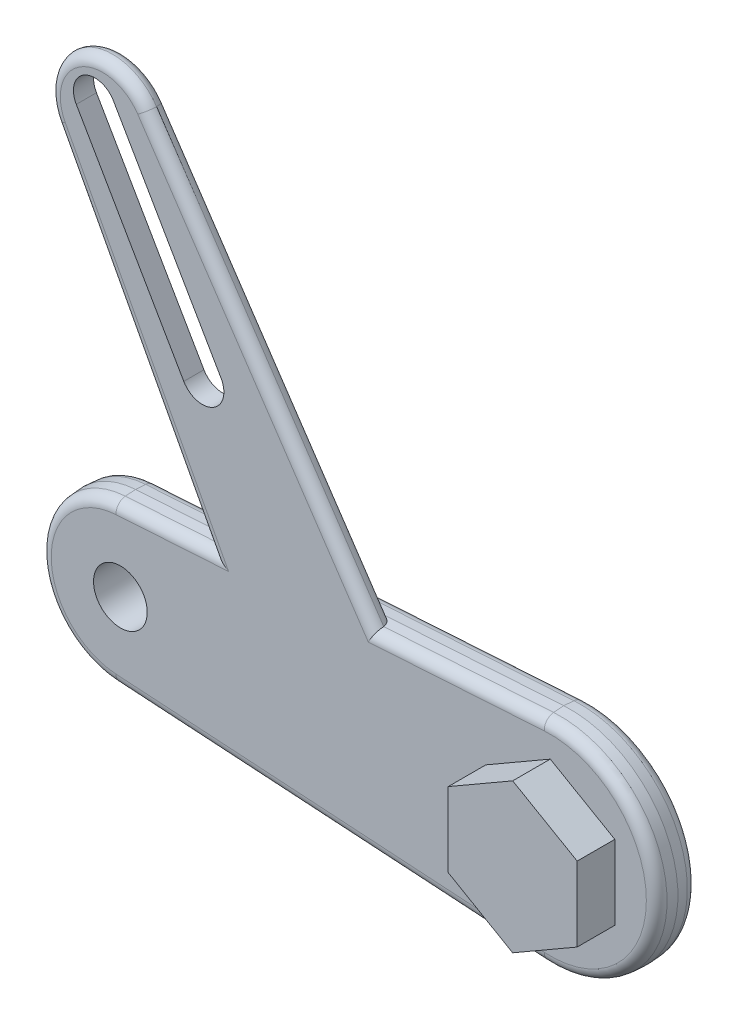
ISO-10303-21;
HEADER;
FILE_DESCRIPTION(('STEP AP214'),'2;1');
FILE_NAME('part.step','',(''),(''),'','','');
FILE_SCHEMA(('AUTOMOTIVE_DESIGN { 1 0 10303 214 1 1 1 1 }'));
ENDSEC;
DATA;
#1=APPLICATION_CONTEXT('core data for automotive mechanical design processes');
#2=APPLICATION_PROTOCOL_DEFINITION('international standard','automotive_design',2000,#1);
#3=PRODUCT_CONTEXT('',#1,'mechanical');
#4=PRODUCT('Part','Part','',(#3));
#5=PRODUCT_RELATED_PRODUCT_CATEGORY('part','',(#4));
#6=PRODUCT_DEFINITION_FORMATION('','',#4);
#7=PRODUCT_DEFINITION_CONTEXT('part definition',#1,'design');
#8=PRODUCT_DEFINITION('design','',#6,#7);
#9=PRODUCT_DEFINITION_SHAPE('','',#8);
#10=(LENGTH_UNIT() NAMED_UNIT(*) SI_UNIT(.MILLI.,.METRE.));
#11=(NAMED_UNIT(*) PLANE_ANGLE_UNIT() SI_UNIT($,.RADIAN.));
#12=(NAMED_UNIT(*) SI_UNIT($,.STERADIAN.) SOLID_ANGLE_UNIT());
#13=UNCERTAINTY_MEASURE_WITH_UNIT(LENGTH_MEASURE(1.E-05),#10,'distance_accuracy_value','');
#14=(GEOMETRIC_REPRESENTATION_CONTEXT(3) GLOBAL_UNCERTAINTY_ASSIGNED_CONTEXT((#13)) GLOBAL_UNIT_ASSIGNED_CONTEXT((#10,
#11,#12)) REPRESENTATION_CONTEXT('',''));
#15=CARTESIAN_POINT('',(0.,0.,0.));
#16=DIRECTION('',(0.,0.,1.));
#17=DIRECTION('',(1.,0.,0.));
#18=AXIS2_PLACEMENT_3D('',#15,#16,#17);
#19=CARTESIAN_POINT('',(47.1554252199413,0.,3.75));
#20=DIRECTION('',(0.,0.,1.));
#21=DIRECTION('',(1.,0.,0.));
#22=AXIS2_PLACEMENT_3D('',#19,#20,#21);
#23=PLANE('',#22);
#24=DIRECTION('',(-0.469471562785901,0.882947592858921,0.));
#25=VECTOR('',#24,1.);
#26=CARTESIAN_POINT('',(-14.0714459827987,16.7147194827275,3.75));
#27=LINE('',#26,#25);
#28=CARTESIAN_POINT('',(-43.0970655830937,71.303970438076,3.75));
#29=VERTEX_POINT('',#28);
#30=CARTESIAN_POINT('',(-12.7123795267605,14.1586872306922,3.75));
#31=VERTEX_POINT('',#30);
#32=EDGE_CURVE('E379',#29,#31,#27,.F.);
#33=ORIENTED_EDGE('',*,*,#32,.T.);
#34=DIRECTION('',(0.998044963916957,0.0625000000000001,0.));
#35=VECTOR('',#34,1.);
#36=CARTESIAN_POINT('',(-33.6491212977422,12.8475776033756,3.75));
#37=LINE('',#36,#35);
#38=CARTESIAN_POINT('',(-33.6491212977422,12.8475776033756,3.75));
#39=VERTEX_POINT('',#38);
#40=EDGE_CURVE('E391',#31,#39,#37,.F.);
#41=ORIENTED_EDGE('',*,*,#40,.T.);
#42=CARTESIAN_POINT('',(-32.8445747800587,0.,3.75));
#43=DIRECTION('',(0.,0.,1.));
#44=DIRECTION('',(1.,0.,0.));
#45=AXIS2_PLACEMENT_3D('',#42,#43,#44);
#46=CIRCLE('',#45,12.8727442829365);
#47=CARTESIAN_POINT('',(-33.6491212977422,-12.8475776033756,3.75));
#48=VERTEX_POINT('',#47);
#49=EDGE_CURVE('E388',#39,#48,#46,.T.);
#50=ORIENTED_EDGE('',*,*,#49,.T.);
#51=DIRECTION('',(-0.998044963916957,0.0625,0.));
#52=VECTOR('',#51,1.);
#53=CARTESIAN_POINT('',(46.0383787022578,-17.8378024229604,3.75));
#54=LINE('',#53,#52);
#55=CARTESIAN_POINT('',(46.0383787022578,-17.8378024229604,3.75));
#56=VERTEX_POINT('',#55);
#57=EDGE_CURVE('E385',#48,#56,#54,.F.);
#58=ORIENTED_EDGE('',*,*,#57,.T.);
#59=CARTESIAN_POINT('',(47.1554252199413,0.,3.75));
#60=DIRECTION('',(0.,0.,1.));
#61=DIRECTION('',(1.,0.,0.));
#62=AXIS2_PLACEMENT_3D('',#59,#60,#61);
#63=CIRCLE('',#62,17.8727442829365);
#64=CARTESIAN_POINT('',(46.0383787022578,17.8378024229604,3.75));
#65=VERTEX_POINT('',#64);
#66=EDGE_CURVE('E382',#56,#65,#63,.T.);
#67=ORIENTED_EDGE('',*,*,#66,.T.);
#68=DIRECTION('',(0.998044963916957,0.0625000000000001,0.));
#69=VECTOR('',#68,1.);
#70=CARTESIAN_POINT('',(14.3557226783546,15.853757542134,3.75));
#71=LINE('',#70,#69);
#72=CARTESIAN_POINT('',(13.2900577713771,15.7870230170434,3.75));
#73=VERTEX_POINT('',#72);
#74=EDGE_CURVE('E373',#65,#73,#71,.F.);
#75=ORIENTED_EDGE('',*,*,#74,.T.);
#76=DIRECTION('',(0.559192903470745,-0.829037572555043,0.));
#77=VECTOR('',#76,1.);
#78=CARTESIAN_POINT('',(-29.6190441596088,79.4023827338579,3.75));
#79=LINE('',#78,#77);
#80=CARTESIAN_POINT('',(-29.6190441596088,79.402382733858,3.75));
#81=VERTEX_POINT('',#80);
#82=EDGE_CURVE('E370',#73,#81,#79,.F.);
#83=ORIENTED_EDGE('',*,*,#82,.T.);
#84=CARTESIAN_POINT('',(-36.1458449692811,75.,3.75));
#85=DIRECTION('',(0.,0.,1.));
#86=DIRECTION('',(1.,0.,0.));
#87=AXIS2_PLACEMENT_3D('',#84,#85,#86);
#88=CIRCLE('',#87,7.87274428293651);
#89=EDGE_CURVE('E376',#81,#29,#88,.T.);
#90=ORIENTED_EDGE('',*,*,#89,.T.);
#91=EDGE_LOOP('',(#33,#41,#50,#58,#67,#75,#83,#90));
#92=FACE_BOUND('',#91,.T.);
#93=CARTESIAN_POINT('',(-32.8445747800587,0.,3.75));
#94=DIRECTION('',(0.,0.,1.));
#95=DIRECTION('',(1.,0.,0.));
#96=AXIS2_PLACEMENT_3D('',#93,#94,#95);
#97=CIRCLE('',#96,5.);
#98=CARTESIAN_POINT('',(-27.8445747800587,0.,3.75));
#99=VERTEX_POINT('',#98);
#100=EDGE_CURVE('E244',#99,#99,#97,.T.);
#101=ORIENTED_EDGE('',*,*,#100,.F.);
#102=EDGE_LOOP('',(#101));
#103=FACE_BOUND('',#102,.T.);
#104=CARTESIAN_POINT('',(-37.5834260577962,77.2693038813946,3.75));
#105=DIRECTION('',(0.,0.,1.));
#106=DIRECTION('',(1.,0.,0.));
#107=AXIS2_PLACEMENT_3D('',#104,#105,#106);
#108=CIRCLE('',#107,4.00000000000002);
#109=CARTESIAN_POINT('',(-34.1193244426584,79.2693038813946,3.75));
#110=VERTEX_POINT('',#109);
#111=CARTESIAN_POINT('',(-41.047527672934,75.2693038813945,3.75));
#112=VERTEX_POINT('',#111);
#113=EDGE_CURVE('E258',#110,#112,#108,.T.);
#114=ORIENTED_EDGE('',*,*,#113,.F.);
#115=DIRECTION('',(-0.500000000000003,0.866025403784437,0.));
#116=VECTOR('',#115,1.);
#117=CARTESIAN_POINT('',(-34.1193244426584,79.2693038813946,3.75));
#118=LINE('',#117,#116);
#119=CARTESIAN_POINT('',(-14.1193244426584,44.6282877300171,3.75));
#120=VERTEX_POINT('',#119);
#121=EDGE_CURVE('E270',#120,#110,#118,.T.);
#122=ORIENTED_EDGE('',*,*,#121,.F.);
#123=CARTESIAN_POINT('',(-17.5834260577961,42.6282877300171,3.75));
#124=DIRECTION('',(0.,0.,1.));
#125=DIRECTION('',(1.,0.,0.));
#126=AXIS2_PLACEMENT_3D('',#123,#124,#125);
#127=CIRCLE('',#126,4.00000000000013);
#128=CARTESIAN_POINT('',(-21.0475276729339,40.628287730017,3.75));
#129=VERTEX_POINT('',#128);
#130=EDGE_CURVE('E266',#129,#120,#127,.T.);
#131=ORIENTED_EDGE('',*,*,#130,.F.);
#132=DIRECTION('',(0.499999999999998,-0.86602540378444,0.));
#133=VECTOR('',#132,1.);
#134=CARTESIAN_POINT('',(-41.047527672934,75.2693038813945,3.75));
#135=LINE('',#134,#133);
#136=EDGE_CURVE('E262',#112,#129,#135,.T.);
#137=ORIENTED_EDGE('',*,*,#136,.F.);
#138=EDGE_LOOP('',(#114,#122,#131,#137));
#139=FACE_BOUND('',#138,.T.);
#140=DIRECTION('',(-0.866025403784439,-0.5,0.));
#141=VECTOR('',#140,1.);
#142=CARTESIAN_POINT('',(47.1554252199414,13.856406460551,3.75));
#143=LINE('',#142,#141);
#144=CARTESIAN_POINT('',(47.1554252199414,13.856406460551,3.75));
#145=VERTEX_POINT('',#144);
#146=CARTESIAN_POINT('',(35.1554252199413,6.92820323027551,3.75));
#147=VERTEX_POINT('',#146);
#148=EDGE_CURVE('E1030',#145,#147,#143,.T.);
#149=ORIENTED_EDGE('',*,*,#148,.F.);
#150=DIRECTION('',(-0.866025403784438,0.5,0.));
#151=VECTOR('',#150,1.);
#152=CARTESIAN_POINT('',(59.1554252199414,6.92820323027551,3.75));
#153=LINE('',#152,#151);
#154=CARTESIAN_POINT('',(59.1554252199414,6.92820323027551,3.75));
#155=VERTEX_POINT('',#154);
#156=EDGE_CURVE('E241',#155,#145,#153,.T.);
#157=ORIENTED_EDGE('',*,*,#156,.F.);
#158=DIRECTION('',(0.,1.,0.));
#159=VECTOR('',#158,1.);
#160=CARTESIAN_POINT('',(59.1554252199414,-6.92820323027551,3.75));
#161=LINE('',#160,#159);
#162=CARTESIAN_POINT('',(59.1554252199414,-6.92820323027551,3.75));
#163=VERTEX_POINT('',#162);
#164=EDGE_CURVE('E237',#163,#155,#161,.T.);
#165=ORIENTED_EDGE('',*,*,#164,.F.);
#166=DIRECTION('',(0.866025403784439,0.5,0.));
#167=VECTOR('',#166,1.);
#168=CARTESIAN_POINT('',(47.1554252199413,-13.856406460551,3.75));
#169=LINE('',#168,#167);
#170=CARTESIAN_POINT('',(47.1554252199413,-13.856406460551,3.75));
#171=VERTEX_POINT('',#170);
#172=EDGE_CURVE('E1025',#171,#163,#169,.T.);
#173=ORIENTED_EDGE('',*,*,#172,.F.);
#174=DIRECTION('',(0.866025403784438,-0.5,0.));
#175=VECTOR('',#174,1.);
#176=CARTESIAN_POINT('',(35.1554252199413,-6.92820323027551,3.75));
#177=LINE('',#176,#175);
#178=CARTESIAN_POINT('',(35.1554252199413,-6.92820323027551,3.75));
#179=VERTEX_POINT('',#178);
#180=EDGE_CURVE('E1042',#179,#171,#177,.T.);
#181=ORIENTED_EDGE('',*,*,#180,.F.);
#182=DIRECTION('',(0.,-1.,0.));
#183=VECTOR('',#182,1.);
#184=CARTESIAN_POINT('',(35.1554252199413,6.92820323027551,3.75));
#185=LINE('',#184,#183);
#186=EDGE_CURVE('E1035',#147,#179,#185,.T.);
#187=ORIENTED_EDGE('',*,*,#186,.F.);
#188=EDGE_LOOP('',(#149,#157,#165,#173,#181,#187));
#189=FACE_BOUND('',#188,.T.);
#190=ADVANCED_FACE('F44',(#92,#103,#139,#189),#23,.T.);
#191=CARTESIAN_POINT('',(-33.7820747800587,14.9706744587544,0.));
#192=DIRECTION('',(-0.0623477531412391,0.99561377654642,0.0697564737441255));
#193=DIRECTION('',(0.,-0.0698924504621114,0.997554532528624));
#194=AXIS2_PLACEMENT_3D('',#191,#192,#193);
#195=PLANE('',#194);
#196=DIRECTION('',(-0.00435977960900785,0.0696200973209298,-0.997564050259824));
#197=VECTOR('',#196,1.);
#198=CARTESIAN_POINT('',(-33.7820747800587,14.9706744587544,0.));
#199=LINE('',#198,#197);
#200=CARTESIAN_POINT('',(-33.7738168040247,14.8388051564684,1.88951294748825));
#201=VERTEX_POINT('',#200);
#202=CARTESIAN_POINT('',(-33.7820747800587,14.9706744587544,0.));
#203=VERTEX_POINT('',#202);
#204=EDGE_CURVE('E292',#201,#203,#199,.T.);
#205=ORIENTED_EDGE('',*,*,#204,.F.);
#206=DIRECTION('',(-0.998044963916957,-0.0625000000000001,0.));
#207=VECTOR('',#206,1.);
#208=CARTESIAN_POINT('',(-15.7263010045337,15.9689844352068,1.88951294748825));
#209=LINE('',#208,#207);
#210=CARTESIAN_POINT('',(-15.9278432201549,15.9563633720967,1.88951294748825));
#211=VERTEX_POINT('',#210);
#212=EDGE_CURVE('E395',#201,#211,#209,.F.);
#213=ORIENTED_EDGE('',*,*,#212,.T.);
#214=CARTESIAN_POINT('',(-13.7350591441457,16.0859396958927,2.));
#215=DIRECTION('',(-0.0623477531412391,0.99561377654642,0.0697564737441255));
#216=DIRECTION('',(0.987129361998023,0.0512013597358323,0.151505918836785));
#217=AXIS2_PLACEMENT_3D('',#214,#215,#216);
#218=ELLIPSE('',#217,2.20180589262586,2.);
#219=CARTESIAN_POINT('',(-13.8071653823816,16.2215518064594,0.));
#220=VERTEX_POINT('',#219);
#221=EDGE_CURVE('E55',#211,#220,#218,.F.);
#222=ORIENTED_EDGE('',*,*,#221,.T.);
#223=DIRECTION('',(-0.998044963916957,-0.0625000000000001,0.));
#224=VECTOR('',#223,1.);
#225=CARTESIAN_POINT('',(-33.7820747800587,14.9706744587544,0.));
#226=LINE('',#225,#224);
#227=EDGE_CURVE('E63',#220,#203,#226,.T.);
#228=ORIENTED_EDGE('',*,*,#227,.T.);
#229=EDGE_LOOP('',(#205,#213,#222,#228));
#230=FACE_BOUND('',#229,.T.);
#231=ADVANCED_FACE('F512',(#230),#195,.T.);
#232=CARTESIAN_POINT('',(45.9054252199413,19.9608992783391,0.));
#233=VERTEX_POINT('',#232);
#234=CARTESIAN_POINT('',(11.9085561692417,17.8319327563002,0.));
#235=VERTEX_POINT('',#234);
#236=EDGE_CURVE('E303',#233,#235,#226,.T.);
#237=ORIENTED_EDGE('',*,*,#236,.T.);
#238=CARTESIAN_POINT('',(11.9992428660925,17.6974841991859,2.));
#239=DIRECTION('',(-0.0623477531412391,0.99561377654642,0.0697564737441255));
#240=DIRECTION('',(-0.991588061139328,-0.053849115379293,-0.117700423868464));
#241=AXIS2_PLACEMENT_3D('',#238,#239,#240);
#242=ELLIPSE('',#241,2.32486325694468,2.);
#243=CARTESIAN_POINT('',(14.3053641981757,17.8496402603742,1.88951294748825));
#244=VERTEX_POINT('',#243);
#245=EDGE_CURVE('E11',#235,#244,#242,.F.);
#246=ORIENTED_EDGE('',*,*,#245,.T.);
#247=DIRECTION('',(-0.998044963916957,-0.0625000000000001,0.));
#248=VECTOR('',#247,1.);
#249=CARTESIAN_POINT('',(45.9136831959753,19.8290299760532,1.88951294748825));
#250=LINE('',#249,#248);
#251=CARTESIAN_POINT('',(45.9136831959753,19.8290299760532,1.88951294748825));
#252=VERTEX_POINT('',#251);
#253=EDGE_CURVE('E419',#244,#252,#250,.F.);
#254=ORIENTED_EDGE('',*,*,#253,.T.);
#255=DIRECTION('',(-0.00435977960900785,0.0696200973209298,-0.997564050259824));
#256=VECTOR('',#255,1.);
#257=CARTESIAN_POINT('',(45.9054252199413,19.9608992783391,0.));
#258=LINE('',#257,#256);
#259=EDGE_CURVE('E288',#252,#233,#258,.T.);
#260=ORIENTED_EDGE('',*,*,#259,.T.);
#261=EDGE_LOOP('',(#237,#246,#254,#260));
#262=FACE_BOUND('',#261,.T.);
#263=ADVANCED_FACE('F585',(#262),#195,.T.);
#264=CARTESIAN_POINT('',(47.1554252199413,0.,0.));
#265=DIRECTION('',(0.,0.,1.));
#266=DIRECTION('',(1.,0.,0.));
#267=AXIS2_PLACEMENT_3D('',#264,#265,#266);
#268=CONICAL_SURFACE('',#267,20.,0.0698131700797733);
#269=DIRECTION('',(-0.00435977960900784,-0.0696200973209298,0.997564050259824));
#270=VECTOR('',#269,1.);
#271=CARTESIAN_POINT('',(45.9054252199413,-19.9608992783391,0.));
#272=LINE('',#271,#270);
#273=CARTESIAN_POINT('',(45.9136831959753,-19.8290299760532,-1.88951294748825));
#274=VERTEX_POINT('',#273);
#275=CARTESIAN_POINT('',(45.9054252199413,-19.9608992783391,0.));
#276=VERTEX_POINT('',#275);
#277=EDGE_CURVE('E317',#274,#276,#272,.T.);
#278=ORIENTED_EDGE('',*,*,#277,.F.);
#279=CARTESIAN_POINT('',(47.1554252199413,0.,-1.88951294748825));
#280=DIRECTION('',(0.,0.,1.));
#281=DIRECTION('',(1.,0.,0.));
#282=AXIS2_PLACEMENT_3D('',#279,#280,#281);
#283=CIRCLE('',#282,19.8678723834562);
#284=CARTESIAN_POINT('',(45.9136831959753,19.8290299760532,-1.88951294748825));
#285=VERTEX_POINT('',#284);
#286=EDGE_CURVE('E416',#274,#285,#283,.T.);
#287=ORIENTED_EDGE('',*,*,#286,.T.);
#288=DIRECTION('',(-0.00435977960900784,0.0696200973209298,0.997564050259824));
#289=VECTOR('',#288,1.);
#290=CARTESIAN_POINT('',(45.9054252199413,19.9608992783391,0.));
#291=LINE('',#290,#289);
#292=EDGE_CURVE('E316',#285,#233,#291,.T.);
#293=ORIENTED_EDGE('',*,*,#292,.T.);
#294=CARTESIAN_POINT('',(47.1554252199413,0.,0.));
#295=DIRECTION('',(0.,0.,1.));
#296=DIRECTION('',(1.,0.,0.));
#297=AXIS2_PLACEMENT_3D('',#294,#295,#296);
#298=CIRCLE('',#297,20.);
#299=EDGE_CURVE('E291',#276,#233,#298,.T.);
#300=ORIENTED_EDGE('',*,*,#299,.F.);
#301=EDGE_LOOP('',(#278,#287,#293,#300));
#302=FACE_BOUND('',#301,.T.);
#303=ADVANCED_FACE('F601',(#302),#268,.T.);
#304=CARTESIAN_POINT('',(-33.7820747800587,-14.9706744587544,0.));
#305=DIRECTION('',(-0.062347753141239,-0.99561377654642,-0.0697564737441255));
#306=DIRECTION('',(0.,0.0698924504621114,-0.997554532528624));
#307=AXIS2_PLACEMENT_3D('',#304,#305,#306);
#308=PLANE('',#307);
#309=DIRECTION('',(-0.00435977960900785,-0.0696200973209298,0.997564050259824));
#310=VECTOR('',#309,1.);
#311=CARTESIAN_POINT('',(-33.7820747800587,-14.9706744587544,0.));
#312=LINE('',#311,#310);
#313=CARTESIAN_POINT('',(-33.7738168040247,-14.8388051564684,-1.88951294748825));
#314=VERTEX_POINT('',#313);
#315=CARTESIAN_POINT('',(-33.7820747800587,-14.9706744587544,0.));
#316=VERTEX_POINT('',#315);
#317=EDGE_CURVE('E322',#314,#316,#312,.T.);
#318=ORIENTED_EDGE('',*,*,#317,.F.);
#319=DIRECTION('',(0.998044963916957,-0.0625,0.));
#320=VECTOR('',#319,1.);
#321=CARTESIAN_POINT('',(45.9136831959753,-19.8290299760532,-1.88951294748825));
#322=LINE('',#321,#320);
#323=EDGE_CURVE('E347',#314,#274,#322,.T.);
#324=ORIENTED_EDGE('',*,*,#323,.T.);
#325=ORIENTED_EDGE('',*,*,#277,.T.);
#326=DIRECTION('',(0.998044963916957,-0.0625,0.));
#327=VECTOR('',#326,1.);
#328=CARTESIAN_POINT('',(-33.7820747800587,-14.9706744587544,0.));
#329=LINE('',#328,#327);
#330=EDGE_CURVE('E312',#316,#276,#329,.T.);
#331=ORIENTED_EDGE('',*,*,#330,.F.);
#332=EDGE_LOOP('',(#318,#324,#325,#331));
#333=FACE_BOUND('',#332,.T.);
#334=ADVANCED_FACE('F548',(#333),#308,.T.);
#335=CARTESIAN_POINT('',(-32.8445747800587,0.,0.));
#336=DIRECTION('',(0.,0.,1.));
#337=DIRECTION('',(1.,0.,0.));
#338=AXIS2_PLACEMENT_3D('',#335,#336,#337);
#339=CONICAL_SURFACE('',#338,15.,0.0698131700797733);
#340=DIRECTION('',(-0.00435977960900785,0.0696200973209298,0.997564050259824));
#341=VECTOR('',#340,1.);
#342=CARTESIAN_POINT('',(-33.7820747800587,14.9706744587544,0.));
#343=LINE('',#342,#341);
#344=CARTESIAN_POINT('',(-33.7738168040247,14.8388051564684,-1.88951294748825));
#345=VERTEX_POINT('',#344);
#346=EDGE_CURVE('E326',#345,#203,#343,.T.);
#347=ORIENTED_EDGE('',*,*,#346,.F.);
#348=CARTESIAN_POINT('',(-32.8445747800587,0.,-1.88951294748825));
#349=DIRECTION('',(0.,0.,1.));
#350=DIRECTION('',(1.,0.,0.));
#351=AXIS2_PLACEMENT_3D('',#348,#349,#350);
#352=CIRCLE('',#351,14.8678723834562);
#353=EDGE_CURVE('E364',#345,#314,#352,.T.);
#354=ORIENTED_EDGE('',*,*,#353,.T.);
#355=ORIENTED_EDGE('',*,*,#317,.T.);
#356=CARTESIAN_POINT('',(-32.8445747800587,0.,0.));
#357=DIRECTION('',(0.,0.,1.));
#358=DIRECTION('',(1.,0.,0.));
#359=AXIS2_PLACEMENT_3D('',#356,#357,#358);
#360=CIRCLE('',#359,15.);
#361=EDGE_CURVE('E307',#203,#316,#360,.T.);
#362=ORIENTED_EDGE('',*,*,#361,.F.);
#363=EDGE_LOOP('',(#347,#354,#355,#362));
#364=FACE_BOUND('',#363,.T.);
#365=ADVANCED_FACE('F516',(#364),#339,.T.);
#366=CARTESIAN_POINT('',(-33.7820747800587,14.9706744587544,0.));
#367=DIRECTION('',(-0.0623477531412391,0.99561377654642,-0.0697564737441255));
#368=DIRECTION('',(0.,0.0698924504621114,0.997554532528624));
#369=AXIS2_PLACEMENT_3D('',#366,#367,#368);
#370=PLANE('',#369);
#371=ORIENTED_EDGE('',*,*,#292,.F.);
#372=DIRECTION('',(-0.998044963916957,-0.0625000000000001,0.));
#373=VECTOR('',#372,1.);
#374=CARTESIAN_POINT('',(-33.7738168040247,14.8388051564684,-1.88951294748825));
#375=LINE('',#374,#373);
#376=EDGE_CURVE('E367',#285,#345,#375,.T.);
#377=ORIENTED_EDGE('',*,*,#376,.T.);
#378=ORIENTED_EDGE('',*,*,#346,.T.);
#379=ORIENTED_EDGE('',*,*,#227,.F.);
#380=EDGE_CURVE('E308',#235,#220,#226,.T.);
#381=ORIENTED_EDGE('',*,*,#380,.F.);
#382=ORIENTED_EDGE('',*,*,#236,.F.);
#383=EDGE_LOOP('',(#371,#377,#378,#379,#381,#382));
#384=FACE_BOUND('',#383,.T.);
#385=ADVANCED_FACE('F504',(#384),#370,.T.);
#386=CARTESIAN_POINT('',(47.1554252199413,0.,-3.75));
#387=DIRECTION('',(0.,0.,1.));
#388=DIRECTION('',(1.,0.,0.));
#389=AXIS2_PLACEMENT_3D('',#386,#387,#388);
#390=PLANE('',#389);
#391=CARTESIAN_POINT('',(47.1554252199413,0.,-3.75));
#392=DIRECTION('',(0.,0.,1.));
#393=DIRECTION('',(1.,0.,0.));
#394=AXIS2_PLACEMENT_3D('',#391,#392,#393);
#395=CIRCLE('',#394,17.8727442829365);
#396=CARTESIAN_POINT('',(46.0383787022578,17.8378024229604,-3.75));
#397=VERTEX_POINT('',#396);
#398=CARTESIAN_POINT('',(46.0383787022578,-17.8378024229604,-3.75));
#399=VERTEX_POINT('',#398);
#400=EDGE_CURVE('E351',#397,#399,#395,.F.);
#401=ORIENTED_EDGE('',*,*,#400,.T.);
#402=DIRECTION('',(0.998044963916957,-0.0625,0.));
#403=VECTOR('',#402,1.);
#404=CARTESIAN_POINT('',(-33.6491212977422,-12.8475776033756,-3.75));
#405=LINE('',#404,#403);
#406=CARTESIAN_POINT('',(-33.6491212977422,-12.8475776033756,-3.75));
#407=VERTEX_POINT('',#406);
#408=EDGE_CURVE('E360',#399,#407,#405,.F.);
#409=ORIENTED_EDGE('',*,*,#408,.T.);
#410=CARTESIAN_POINT('',(-32.8445747800587,0.,-3.75));
#411=DIRECTION('',(0.,0.,1.));
#412=DIRECTION('',(1.,0.,0.));
#413=AXIS2_PLACEMENT_3D('',#410,#411,#412);
#414=CIRCLE('',#413,12.8727442829365);
#415=CARTESIAN_POINT('',(-33.6491212977422,12.8475776033756,-3.75));
#416=VERTEX_POINT('',#415);
#417=EDGE_CURVE('E357',#407,#416,#414,.F.);
#418=ORIENTED_EDGE('',*,*,#417,.T.);
#419=DIRECTION('',(-0.998044963916957,-0.0625000000000001,0.));
#420=VECTOR('',#419,1.);
#421=CARTESIAN_POINT('',(46.0383787022578,17.8378024229604,-3.75));
#422=LINE('',#421,#420);
#423=EDGE_CURVE('E354',#416,#397,#422,.F.);
#424=ORIENTED_EDGE('',*,*,#423,.T.);
#425=EDGE_LOOP('',(#401,#409,#418,#424));
#426=FACE_BOUND('',#425,.T.);
#427=CARTESIAN_POINT('',(-32.8445747800587,0.,-3.75));
#428=DIRECTION('',(0.,0.,1.));
#429=DIRECTION('',(1.,0.,0.));
#430=AXIS2_PLACEMENT_3D('',#427,#428,#429);
#431=CIRCLE('',#430,5.);
#432=CARTESIAN_POINT('',(-27.8445747800587,0.,-3.75));
#433=VERTEX_POINT('',#432);
#434=EDGE_CURVE('E250',#433,#433,#431,.T.);
#435=ORIENTED_EDGE('',*,*,#434,.T.);
#436=EDGE_LOOP('',(#435));
#437=FACE_BOUND('',#436,.T.);
#438=ADVANCED_FACE('F538',(#426,#437),#390,.F.);
#439=CARTESIAN_POINT('',(47.1554252199413,0.,0.));
#440=DIRECTION('',(0.,0.,-1.));
#441=DIRECTION('',(1.,0.,0.));
#442=AXIS2_PLACEMENT_3D('',#439,#440,#441);
#443=CONICAL_SURFACE('',#442,20.,0.0698131700797733);
#444=ORIENTED_EDGE('',*,*,#259,.F.);
#445=CARTESIAN_POINT('',(47.1554252199413,0.,1.88951294748825));
#446=DIRECTION('',(0.,0.,-1.));
#447=DIRECTION('',(-1.,0.,0.));
#448=AXIS2_PLACEMENT_3D('',#445,#446,#447);
#449=CIRCLE('',#448,19.8678723834562);
#450=CARTESIAN_POINT('',(45.9136831959753,-19.8290299760532,1.88951294748825));
#451=VERTEX_POINT('',#450);
#452=EDGE_CURVE('E405',#252,#451,#449,.T.);
#453=ORIENTED_EDGE('',*,*,#452,.T.);
#454=DIRECTION('',(-0.00435977960900784,-0.0696200973209298,-0.997564050259824));
#455=VECTOR('',#454,1.);
#456=CARTESIAN_POINT('',(45.9054252199413,-19.9608992783391,0.));
#457=LINE('',#456,#455);
#458=EDGE_CURVE('E278',#451,#276,#457,.T.);
#459=ORIENTED_EDGE('',*,*,#458,.T.);
#460=ORIENTED_EDGE('',*,*,#299,.T.);
#461=EDGE_LOOP('',(#444,#453,#459,#460));
#462=FACE_BOUND('',#461,.T.);
#463=ADVANCED_FACE('F591',(#462),#443,.T.);
#464=CARTESIAN_POINT('',(-32.8445747800587,0.,0.));
#465=DIRECTION('',(0.,0.,-1.));
#466=DIRECTION('',(1.,0.,0.));
#467=AXIS2_PLACEMENT_3D('',#464,#465,#466);
#468=CONICAL_SURFACE('',#467,15.,0.0698131700797733);
#469=DIRECTION('',(-0.00435977960900784,-0.0696200973209298,-0.997564050259824));
#470=VECTOR('',#469,1.);
#471=CARTESIAN_POINT('',(-33.7820747800587,-14.9706744587544,0.));
#472=LINE('',#471,#470);
#473=CARTESIAN_POINT('',(-33.7738168040247,-14.8388051564684,1.88951294748825));
#474=VERTEX_POINT('',#473);
#475=EDGE_CURVE('E295',#474,#316,#472,.T.);
#476=ORIENTED_EDGE('',*,*,#475,.F.);
#477=CARTESIAN_POINT('',(-32.8445747800587,0.,1.88951294748825));
#478=DIRECTION('',(0.,0.,-1.));
#479=DIRECTION('',(-1.,0.,0.));
#480=AXIS2_PLACEMENT_3D('',#477,#478,#479);
#481=CIRCLE('',#480,14.8678723834562);
#482=EDGE_CURVE('E399',#474,#201,#481,.T.);
#483=ORIENTED_EDGE('',*,*,#482,.T.);
#484=ORIENTED_EDGE('',*,*,#204,.T.);
#485=ORIENTED_EDGE('',*,*,#361,.T.);
#486=EDGE_LOOP('',(#476,#483,#484,#485));
#487=FACE_BOUND('',#486,.T.);
#488=ADVANCED_FACE('F522',(#487),#468,.T.);
#489=CARTESIAN_POINT('',(-33.7820747800587,-14.9706744587544,0.));
#490=DIRECTION('',(-0.062347753141239,-0.99561377654642,0.0697564737441255));
#491=DIRECTION('',(0.,-0.0698924504621114,-0.997554532528624));
#492=AXIS2_PLACEMENT_3D('',#489,#490,#491);
#493=PLANE('',#492);
#494=ORIENTED_EDGE('',*,*,#458,.F.);
#495=DIRECTION('',(0.998044963916957,-0.0625,0.));
#496=VECTOR('',#495,1.);
#497=CARTESIAN_POINT('',(-33.7738168040247,-14.8388051564684,1.88951294748825));
#498=LINE('',#497,#496);
#499=EDGE_CURVE('E402',#451,#474,#498,.F.);
#500=ORIENTED_EDGE('',*,*,#499,.T.);
#501=ORIENTED_EDGE('',*,*,#475,.T.);
#502=ORIENTED_EDGE('',*,*,#330,.T.);
#503=EDGE_LOOP('',(#494,#500,#501,#502));
#504=FACE_BOUND('',#503,.T.);
#505=ADVANCED_FACE('F553',(#504),#493,.T.);
#506=CARTESIAN_POINT('',(-36.1458449692811,75.,0.));
#507=DIRECTION('',(0.,0.,1.));
#508=DIRECTION('',(1.,0.,0.));
#509=AXIS2_PLACEMENT_3D('',#506,#507,#508);
#510=PLANE('',#509);
#511=DIRECTION('',(-0.500000000000003,0.866025403784437,0.));
#512=VECTOR('',#511,1.);
#513=CARTESIAN_POINT('',(-32.7772917654325,76.9448350990216,0.));
#514=LINE('',#513,#512);
#515=CARTESIAN_POINT('',(-14.1193244426584,44.6282877300171,0.));
#516=VERTEX_POINT('',#515);
#517=CARTESIAN_POINT('',(-34.1193244426584,79.2693038813946,0.));
#518=VERTEX_POINT('',#517);
#519=EDGE_CURVE('E339',#516,#518,#514,.T.);
#520=ORIENTED_EDGE('',*,*,#519,.T.);
#521=CARTESIAN_POINT('',(-37.5834260577962,77.2693038813946,0.));
#522=DIRECTION('',(0.,0.,1.));
#523=DIRECTION('',(1.,0.,0.));
#524=AXIS2_PLACEMENT_3D('',#521,#522,#523);
#525=CIRCLE('',#524,4.00000000000002);
#526=CARTESIAN_POINT('',(-41.047527672934,75.2693038813945,0.));
#527=VERTEX_POINT('',#526);
#528=EDGE_CURVE('E343',#518,#527,#525,.T.);
#529=ORIENTED_EDGE('',*,*,#528,.T.);
#530=DIRECTION('',(0.499999999999998,-0.86602540378444,0.));
#531=VECTOR('',#530,1.);
#532=CARTESIAN_POINT('',(-39.705494995708,72.9448350990215,0.));
#533=LINE('',#532,#531);
#534=CARTESIAN_POINT('',(-21.0475276729341,40.628287730017,0.));
#535=VERTEX_POINT('',#534);
#536=EDGE_CURVE('E321',#527,#535,#533,.T.);
#537=ORIENTED_EDGE('',*,*,#536,.T.);
#538=CARTESIAN_POINT('',(-17.5834260577961,42.6282877300171,0.));
#539=DIRECTION('',(0.,0.,1.));
#540=DIRECTION('',(1.,0.,0.));
#541=AXIS2_PLACEMENT_3D('',#538,#539,#540);
#542=CIRCLE('',#541,4.00000000000013);
#543=EDGE_CURVE('E335',#535,#516,#542,.T.);
#544=ORIENTED_EDGE('',*,*,#543,.T.);
#545=EDGE_LOOP('',(#520,#529,#537,#544));
#546=FACE_BOUND('',#545,.T.);
#547=ORIENTED_EDGE('',*,*,#380,.T.);
#548=DIRECTION('',(0.469471562785901,-0.882947592858921,0.));
#549=VECTOR('',#548,1.);
#550=CARTESIAN_POINT('',(-43.095460631344,71.3048238060587,0.));
#551=LINE('',#550,#549);
#552=CARTESIAN_POINT('',(-43.095460631344,71.3048238060587,0.));
#553=VERTEX_POINT('',#552);
#554=EDGE_CURVE('E478',#220,#553,#551,.F.);
#555=ORIENTED_EDGE('',*,*,#554,.T.);
#556=CARTESIAN_POINT('',(-36.1458449692811,75.,0.));
#557=DIRECTION('',(0.,0.,1.));
#558=DIRECTION('',(1.,0.,0.));
#559=AXIS2_PLACEMENT_3D('',#556,#557,#558);
#560=CIRCLE('',#559,7.87092656265198);
#561=CARTESIAN_POINT('',(-29.6205511180211,79.4013662775744,0.));
#562=VERTEX_POINT('',#561);
#563=EDGE_CURVE('E475',#553,#562,#560,.F.);
#564=ORIENTED_EDGE('',*,*,#563,.T.);
#565=DIRECTION('',(-0.559192903470745,0.829037572555043,0.));
#566=VECTOR('',#565,1.);
#567=CARTESIAN_POINT('',(-29.6205511180211,79.4013662775744,0.));
#568=LINE('',#567,#566);
#569=EDGE_CURVE('E426',#562,#235,#568,.F.);
#570=ORIENTED_EDGE('',*,*,#569,.T.);
#571=EDGE_LOOP('',(#547,#555,#564,#570));
#572=FACE_BOUND('',#571,.T.);
#573=ADVANCED_FACE('F501',(#546,#572),#510,.F.);
#574=CARTESIAN_POINT('',(-37.5834260577962,77.2693038813946,-3.75));
#575=DIRECTION('',(0.,0.,1.));
#576=DIRECTION('',(1.,0.,0.));
#577=AXIS2_PLACEMENT_3D('',#574,#575,#576);
#578=CYLINDRICAL_SURFACE('',#577,4.00000000000002);
#579=DIRECTION('',(0.,0.,1.));
#580=VECTOR('',#579,1.);
#581=CARTESIAN_POINT('',(-34.1193244426584,79.2693038813946,-3.75));
#582=LINE('',#581,#580);
#583=EDGE_CURVE('E275',#518,#110,#582,.T.);
#584=ORIENTED_EDGE('',*,*,#583,.T.);
#585=ORIENTED_EDGE('',*,*,#113,.T.);
#586=DIRECTION('',(0.,0.,1.));
#587=VECTOR('',#586,1.);
#588=CARTESIAN_POINT('',(-41.047527672934,75.2693038813945,-3.75));
#589=LINE('',#588,#587);
#590=EDGE_CURVE('E274',#527,#112,#589,.T.);
#591=ORIENTED_EDGE('',*,*,#590,.F.);
#592=ORIENTED_EDGE('',*,*,#528,.F.);
#593=EDGE_LOOP('',(#584,#585,#591,#592));
#594=FACE_BOUND('',#593,.T.);
#595=ADVANCED_FACE('F694',(#594),#578,.F.);
#596=CARTESIAN_POINT('',(-34.1193244426584,79.2693038813946,-3.75));
#597=DIRECTION('',(0.866025403784437,0.500000000000003,0.));
#598=DIRECTION('',(-0.500000000000003,0.866025403784437,0.));
#599=AXIS2_PLACEMENT_3D('',#596,#597,#598);
#600=PLANE('',#599);
#601=DIRECTION('',(0.,0.,1.));
#602=VECTOR('',#601,1.);
#603=CARTESIAN_POINT('',(-14.1193244426584,44.6282877300171,-3.75));
#604=LINE('',#603,#602);
#605=EDGE_CURVE('E279',#516,#120,#604,.T.);
#606=ORIENTED_EDGE('',*,*,#605,.T.);
#607=ORIENTED_EDGE('',*,*,#121,.T.);
#608=ORIENTED_EDGE('',*,*,#583,.F.);
#609=ORIENTED_EDGE('',*,*,#519,.F.);
#610=EDGE_LOOP('',(#606,#607,#608,#609));
#611=FACE_BOUND('',#610,.T.);
#612=ADVANCED_FACE('F701',(#611),#600,.F.);
#613=CARTESIAN_POINT('',(-17.5834260577961,42.6282877300171,-3.75));
#614=DIRECTION('',(0.,0.,1.));
#615=DIRECTION('',(1.,0.,0.));
#616=AXIS2_PLACEMENT_3D('',#613,#614,#615);
#617=CYLINDRICAL_SURFACE('',#616,4.00000000000013);
#618=DIRECTION('',(0.,0.,1.));
#619=VECTOR('',#618,1.);
#620=CARTESIAN_POINT('',(-21.0475276729339,40.628287730017,-3.75));
#621=LINE('',#620,#619);
#622=EDGE_CURVE('E282',#535,#129,#621,.T.);
#623=ORIENTED_EDGE('',*,*,#622,.T.);
#624=ORIENTED_EDGE('',*,*,#130,.T.);
#625=ORIENTED_EDGE('',*,*,#605,.F.);
#626=ORIENTED_EDGE('',*,*,#543,.F.);
#627=EDGE_LOOP('',(#623,#624,#625,#626));
#628=FACE_BOUND('',#627,.T.);
#629=ADVANCED_FACE('F708',(#628),#617,.F.);
#630=CARTESIAN_POINT('',(-41.047527672934,75.2693038813945,-3.75));
#631=DIRECTION('',(-0.86602540378444,-0.499999999999998,0.));
#632=DIRECTION('',(0.499999999999998,-0.86602540378444,0.));
#633=AXIS2_PLACEMENT_3D('',#630,#631,#632);
#634=PLANE('',#633);
#635=ORIENTED_EDGE('',*,*,#590,.T.);
#636=ORIENTED_EDGE('',*,*,#136,.T.);
#637=ORIENTED_EDGE('',*,*,#622,.F.);
#638=ORIENTED_EDGE('',*,*,#536,.F.);
#639=EDGE_LOOP('',(#635,#636,#637,#638));
#640=FACE_BOUND('',#639,.T.);
#641=ADVANCED_FACE('F716',(#640),#634,.F.);
#642=CARTESIAN_POINT('',(-32.8445747800587,0.,-3.75));
#643=DIRECTION('',(0.,0.,1.));
#644=DIRECTION('',(1.,0.,0.));
#645=AXIS2_PLACEMENT_3D('',#642,#643,#644);
#646=CYLINDRICAL_SURFACE('',#645,5.);
#647=ORIENTED_EDGE('',*,*,#434,.F.);
#648=EDGE_LOOP('',(#647));
#649=FACE_BOUND('',#648,.T.);
#650=ORIENTED_EDGE('',*,*,#100,.T.);
#651=EDGE_LOOP('',(#650));
#652=FACE_BOUND('',#651,.T.);
#653=ADVANCED_FACE('F724',(#649,#652),#646,.F.);
#654=CARTESIAN_POINT('',(59.1554252199414,6.92820323027551,10.75));
#655=DIRECTION('',(-0.5,-0.866025403784438,0.));
#656=DIRECTION('',(0.866025403784439,-0.5,0.));
#657=AXIS2_PLACEMENT_3D('',#654,#655,#656);
#658=PLANE('',#657);
#659=ORIENTED_EDGE('',*,*,#156,.T.);
#660=DIRECTION('',(0.,0.,-1.));
#661=VECTOR('',#660,1.);
#662=CARTESIAN_POINT('',(47.1554252199414,13.856406460551,10.75));
#663=LINE('',#662,#661);
#664=CARTESIAN_POINT('',(47.1554252199414,13.856406460551,10.75));
#665=VERTEX_POINT('',#664);
#666=EDGE_CURVE('E219',#665,#145,#663,.T.);
#667=ORIENTED_EDGE('',*,*,#666,.F.);
#668=DIRECTION('',(-0.866025403784438,0.5,0.));
#669=VECTOR('',#668,1.);
#670=CARTESIAN_POINT('',(59.1554252199414,6.92820323027551,10.75));
#671=LINE('',#670,#669);
#672=CARTESIAN_POINT('',(59.1554252199414,6.92820323027551,10.75));
#673=VERTEX_POINT('',#672);
#674=EDGE_CURVE('E227',#673,#665,#671,.T.);
#675=ORIENTED_EDGE('',*,*,#674,.F.);
#676=DIRECTION('',(0.,0.,-1.));
#677=VECTOR('',#676,1.);
#678=CARTESIAN_POINT('',(59.1554252199414,6.92820323027551,10.75));
#679=LINE('',#678,#677);
#680=EDGE_CURVE('E1018',#673,#155,#679,.T.);
#681=ORIENTED_EDGE('',*,*,#680,.T.);
#682=EDGE_LOOP('',(#659,#667,#675,#681));
#683=FACE_BOUND('',#682,.T.);
#684=ADVANCED_FACE('F239',(#683),#658,.F.);
#685=CARTESIAN_POINT('',(47.1554252199414,13.856406460551,10.75));
#686=DIRECTION('',(0.5,-0.866025403784439,0.));
#687=DIRECTION('',(0.866025403784439,0.5,0.));
#688=AXIS2_PLACEMENT_3D('',#685,#686,#687);
#689=PLANE('',#688);
#690=ORIENTED_EDGE('',*,*,#148,.T.);
#691=DIRECTION('',(0.,0.,-1.));
#692=VECTOR('',#691,1.);
#693=CARTESIAN_POINT('',(35.1554252199413,6.92820323027551,10.75));
#694=LINE('',#693,#692);
#695=CARTESIAN_POINT('',(35.1554252199413,6.92820323027551,10.75));
#696=VERTEX_POINT('',#695);
#697=EDGE_CURVE('E222',#696,#147,#694,.T.);
#698=ORIENTED_EDGE('',*,*,#697,.F.);
#699=DIRECTION('',(-0.866025403784439,-0.5,0.));
#700=VECTOR('',#699,1.);
#701=CARTESIAN_POINT('',(47.1554252199414,13.856406460551,10.75));
#702=LINE('',#701,#700);
#703=EDGE_CURVE('E215',#665,#696,#702,.T.);
#704=ORIENTED_EDGE('',*,*,#703,.F.);
#705=ORIENTED_EDGE('',*,*,#666,.T.);
#706=EDGE_LOOP('',(#690,#698,#704,#705));
#707=FACE_BOUND('',#706,.T.);
#708=ADVANCED_FACE('F217',(#707),#689,.F.);
#709=CARTESIAN_POINT('',(35.1554252199413,6.92820323027551,10.75));
#710=DIRECTION('',(1.,0.,0.));
#711=DIRECTION('',(0.,0.,-1.));
#712=AXIS2_PLACEMENT_3D('',#709,#710,#711);
#713=PLANE('',#712);
#714=ORIENTED_EDGE('',*,*,#186,.T.);
#715=DIRECTION('',(0.,0.,-1.));
#716=VECTOR('',#715,1.);
#717=CARTESIAN_POINT('',(35.1554252199413,-6.92820323027551,10.75));
#718=LINE('',#717,#716);
#719=CARTESIAN_POINT('',(35.1554252199413,-6.92820323027551,10.75));
#720=VERTEX_POINT('',#719);
#721=EDGE_CURVE('E252',#720,#179,#718,.T.);
#722=ORIENTED_EDGE('',*,*,#721,.F.);
#723=DIRECTION('',(0.,-1.,0.));
#724=VECTOR('',#723,1.);
#725=CARTESIAN_POINT('',(35.1554252199413,6.92820323027551,10.75));
#726=LINE('',#725,#724);
#727=EDGE_CURVE('E226',#696,#720,#726,.T.);
#728=ORIENTED_EDGE('',*,*,#727,.F.);
#729=ORIENTED_EDGE('',*,*,#697,.T.);
#730=EDGE_LOOP('',(#714,#722,#728,#729));
#731=FACE_BOUND('',#730,.T.);
#732=ADVANCED_FACE('F745',(#731),#713,.F.);
#733=CARTESIAN_POINT('',(35.1554252199413,-6.92820323027551,10.75));
#734=DIRECTION('',(0.5,0.866025403784438,0.));
#735=DIRECTION('',(-0.866025403784438,0.5,0.));
#736=AXIS2_PLACEMENT_3D('',#733,#734,#735);
#737=PLANE('',#736);
#738=ORIENTED_EDGE('',*,*,#180,.T.);
#739=DIRECTION('',(0.,0.,-1.));
#740=VECTOR('',#739,1.);
#741=CARTESIAN_POINT('',(47.1554252199413,-13.856406460551,10.75));
#742=LINE('',#741,#740);
#743=CARTESIAN_POINT('',(47.1554252199413,-13.856406460551,10.75));
#744=VERTEX_POINT('',#743);
#745=EDGE_CURVE('E1049',#744,#171,#742,.T.);
#746=ORIENTED_EDGE('',*,*,#745,.F.);
#747=DIRECTION('',(0.866025403784438,-0.5,0.));
#748=VECTOR('',#747,1.);
#749=CARTESIAN_POINT('',(35.1554252199413,-6.92820323027551,10.75));
#750=LINE('',#749,#748);
#751=EDGE_CURVE('E1059',#720,#744,#750,.T.);
#752=ORIENTED_EDGE('',*,*,#751,.F.);
#753=ORIENTED_EDGE('',*,*,#721,.T.);
#754=EDGE_LOOP('',(#738,#746,#752,#753));
#755=FACE_BOUND('',#754,.T.);
#756=ADVANCED_FACE('F752',(#755),#737,.F.);
#757=CARTESIAN_POINT('',(47.1554252199413,-13.856406460551,10.75));
#758=DIRECTION('',(-0.5,0.866025403784439,0.));
#759=DIRECTION('',(-0.866025403784439,-0.5,0.));
#760=AXIS2_PLACEMENT_3D('',#757,#758,#759);
#761=PLANE('',#760);
#762=ORIENTED_EDGE('',*,*,#172,.T.);
#763=DIRECTION('',(0.,0.,-1.));
#764=VECTOR('',#763,1.);
#765=CARTESIAN_POINT('',(59.1554252199414,-6.92820323027551,10.75));
#766=LINE('',#765,#764);
#767=CARTESIAN_POINT('',(59.1554252199414,-6.92820323027551,10.75));
#768=VERTEX_POINT('',#767);
#769=EDGE_CURVE('E1020',#768,#163,#766,.T.);
#770=ORIENTED_EDGE('',*,*,#769,.F.);
#771=DIRECTION('',(0.866025403784439,0.5,0.));
#772=VECTOR('',#771,1.);
#773=CARTESIAN_POINT('',(47.1554252199413,-13.856406460551,10.75));
#774=LINE('',#773,#772);
#775=EDGE_CURVE('E1061',#744,#768,#774,.T.);
#776=ORIENTED_EDGE('',*,*,#775,.F.);
#777=ORIENTED_EDGE('',*,*,#745,.T.);
#778=EDGE_LOOP('',(#762,#770,#776,#777));
#779=FACE_BOUND('',#778,.T.);
#780=ADVANCED_FACE('F760',(#779),#761,.F.);
#781=CARTESIAN_POINT('',(59.1554252199414,-6.92820323027551,10.75));
#782=DIRECTION('',(-1.,0.,0.));
#783=DIRECTION('',(0.,0.,1.));
#784=AXIS2_PLACEMENT_3D('',#781,#782,#783);
#785=PLANE('',#784);
#786=ORIENTED_EDGE('',*,*,#164,.T.);
#787=ORIENTED_EDGE('',*,*,#680,.F.);
#788=DIRECTION('',(0.,1.,0.));
#789=VECTOR('',#788,1.);
#790=CARTESIAN_POINT('',(59.1554252199414,-6.92820323027551,10.75));
#791=LINE('',#790,#789);
#792=EDGE_CURVE('E232',#768,#673,#791,.T.);
#793=ORIENTED_EDGE('',*,*,#792,.F.);
#794=ORIENTED_EDGE('',*,*,#769,.T.);
#795=EDGE_LOOP('',(#786,#787,#793,#794));
#796=FACE_BOUND('',#795,.T.);
#797=ADVANCED_FACE('F768',(#796),#785,.F.);
#798=CARTESIAN_POINT('',(0.,0.,10.75));
#799=DIRECTION('',(0.,0.,1.));
#800=DIRECTION('',(1.,0.,0.));
#801=AXIS2_PLACEMENT_3D('',#798,#799,#800);
#802=PLANE('',#801);
#803=ORIENTED_EDGE('',*,*,#674,.T.);
#804=ORIENTED_EDGE('',*,*,#703,.T.);
#805=ORIENTED_EDGE('',*,*,#727,.T.);
#806=ORIENTED_EDGE('',*,*,#751,.T.);
#807=ORIENTED_EDGE('',*,*,#775,.T.);
#808=ORIENTED_EDGE('',*,*,#792,.T.);
#809=EDGE_LOOP('',(#803,#804,#805,#806,#807,#808));
#810=FACE_BOUND('',#809,.T.);
#811=ADVANCED_FACE('F230',(#810),#802,.T.);
#812=CARTESIAN_POINT('',(-33.6491212977422,12.8475776033756,-1.75));
#813=DIRECTION('',(0.998044963916957,0.0625000000000001,0.));
#814=DIRECTION('',(-0.0625000000000001,0.998044963916957,0.));
#815=AXIS2_PLACEMENT_3D('',#812,#813,#814);
#816=CYLINDRICAL_SURFACE('',#815,2.);
#817=CARTESIAN_POINT('',(46.0383787022578,17.8378024229604,-1.75));
#818=DIRECTION('',(0.998044963916957,0.0624999999999987,0.));
#819=DIRECTION('',(-0.0624999999999987,0.998044963916957,0.));
#820=AXIS2_PLACEMENT_3D('',#817,#818,#819);
#821=CIRCLE('',#820,2.);
#822=EDGE_CURVE('E434',#397,#285,#821,.T.);
#823=ORIENTED_EDGE('',*,*,#822,.F.);
#824=ORIENTED_EDGE('',*,*,#423,.F.);
#825=CARTESIAN_POINT('',(-33.6491212977422,12.8475776033756,-1.75));
#826=DIRECTION('',(-0.998044963916957,-0.0624999999999987,0.));
#827=DIRECTION('',(0.0624999999999987,-0.998044963916957,0.));
#828=AXIS2_PLACEMENT_3D('',#825,#826,#827);
#829=CIRCLE('',#828,2.);
#830=EDGE_CURVE('E438',#345,#416,#829,.T.);
#831=ORIENTED_EDGE('',*,*,#830,.F.);
#832=ORIENTED_EDGE('',*,*,#376,.F.);
#833=EDGE_LOOP('',(#823,#824,#831,#832));
#834=FACE_BOUND('',#833,.T.);
#835=ADVANCED_FACE('F528',(#834),#816,.T.);
#836=CARTESIAN_POINT('',(-32.8445747800587,0.,-1.75));
#837=DIRECTION('',(0.,0.,1.));
#838=DIRECTION('',(1.,0.,0.));
#839=AXIS2_PLACEMENT_3D('',#836,#837,#838);
#840=TOROIDAL_SURFACE('',#839,12.8727442829365,2.);
#841=ORIENTED_EDGE('',*,*,#830,.T.);
#842=ORIENTED_EDGE('',*,*,#417,.F.);
#843=CARTESIAN_POINT('',(-33.6491212977422,-12.8475776033756,-1.75));
#844=DIRECTION('',(0.998044963916957,-0.0624999999999986,0.));
#845=DIRECTION('',(0.0624999999999986,0.998044963916957,0.));
#846=AXIS2_PLACEMENT_3D('',#843,#844,#845);
#847=CIRCLE('',#846,2.);
#848=EDGE_CURVE('E430',#314,#407,#847,.T.);
#849=ORIENTED_EDGE('',*,*,#848,.F.);
#850=ORIENTED_EDGE('',*,*,#353,.F.);
#851=EDGE_LOOP('',(#841,#842,#849,#850));
#852=FACE_BOUND('',#851,.T.);
#853=ADVANCED_FACE('F546',(#852),#840,.T.);
#854=CARTESIAN_POINT('',(47.1554252199413,0.,-1.75));
#855=DIRECTION('',(0.,0.,1.));
#856=DIRECTION('',(1.,0.,0.));
#857=AXIS2_PLACEMENT_3D('',#854,#855,#856);
#858=TOROIDAL_SURFACE('',#857,17.8727442829365,2.);
#859=ORIENTED_EDGE('',*,*,#822,.T.);
#860=ORIENTED_EDGE('',*,*,#286,.F.);
#861=CARTESIAN_POINT('',(46.0383787022578,-17.8378024229604,-1.75));
#862=DIRECTION('',(-0.998044963916957,0.0624999999999986,0.));
#863=DIRECTION('',(-0.0624999999999986,-0.998044963916957,0.));
#864=AXIS2_PLACEMENT_3D('',#861,#862,#863);
#865=CIRCLE('',#864,2.);
#866=EDGE_CURVE('E427',#399,#274,#865,.T.);
#867=ORIENTED_EDGE('',*,*,#866,.F.);
#868=ORIENTED_EDGE('',*,*,#400,.F.);
#869=EDGE_LOOP('',(#859,#860,#867,#868));
#870=FACE_BOUND('',#869,.T.);
#871=ADVANCED_FACE('F534',(#870),#858,.T.);
#872=CARTESIAN_POINT('',(-33.6491212977422,-12.8475776033756,-1.75));
#873=DIRECTION('',(-0.998044963916957,0.0625,0.));
#874=DIRECTION('',(-0.0625,-0.998044963916957,0.));
#875=AXIS2_PLACEMENT_3D('',#872,#873,#874);
#876=CYLINDRICAL_SURFACE('',#875,2.);
#877=ORIENTED_EDGE('',*,*,#848,.T.);
#878=ORIENTED_EDGE('',*,*,#408,.F.);
#879=ORIENTED_EDGE('',*,*,#866,.T.);
#880=ORIENTED_EDGE('',*,*,#323,.F.);
#881=EDGE_LOOP('',(#877,#878,#879,#880));
#882=FACE_BOUND('',#881,.T.);
#883=ADVANCED_FACE('F541',(#882),#876,.T.);
#884=CARTESIAN_POINT('',(46.0383787022578,17.8378024229604,1.75));
#885=DIRECTION('',(-0.998044963916957,-0.0625000000000001,0.));
#886=DIRECTION('',(0.0625000000000001,-0.998044963916957,0.));
#887=AXIS2_PLACEMENT_3D('',#884,#885,#886);
#888=CYLINDRICAL_SURFACE('',#887,2.);
#889=CARTESIAN_POINT('',(46.0383787022578,17.8378024229604,1.75));
#890=DIRECTION('',(0.998044963916957,0.0624999999999989,0.));
#891=DIRECTION('',(-0.0624999999999989,0.998044963916957,0.));
#892=AXIS2_PLACEMENT_3D('',#889,#890,#891);
#893=CIRCLE('',#892,2.);
#894=EDGE_CURVE('E465',#252,#65,#893,.T.);
#895=ORIENTED_EDGE('',*,*,#894,.F.);
#896=ORIENTED_EDGE('',*,*,#253,.F.);
#897=CARTESIAN_POINT('',(13.2900577713771,15.7870230170434,1.75));
#898=DIRECTION('',(-0.897194100920132,0.441636440156511,0.));
#899=DIRECTION('',(-0.441636440156511,-0.897194100920132,0.));
#900=AXIS2_PLACEMENT_3D('',#897,#898,#899);
#901=ELLIPSE('',#900,2.30457817578041,2.);
#902=EDGE_CURVE('E431',#73,#244,#901,.T.);
#903=ORIENTED_EDGE('',*,*,#902,.F.);
#904=ORIENTED_EDGE('',*,*,#74,.F.);
#905=EDGE_LOOP('',(#895,#896,#903,#904));
#906=FACE_BOUND('',#905,.T.);
#907=ADVANCED_FACE('F613',(#906),#888,.T.);
#908=CARTESIAN_POINT('',(31.1983829548552,-10.7631609114151,1.75));
#909=DIRECTION('',(-0.559192903470745,0.829037572555043,0.));
#910=DIRECTION('',(-0.829037572555043,-0.559192903470745,0.));
#911=AXIS2_PLACEMENT_3D('',#908,#909,#910);
#912=CYLINDRICAL_SURFACE('',#911,2.);
#913=ORIENTED_EDGE('',*,*,#902,.T.);
#914=DIRECTION('',(-0.559192903470745,0.829037572555043,0.));
#915=VECTOR('',#914,1.);
#916=CARTESIAN_POINT('',(14.3470143632135,17.7878913513571,1.88951294748825));
#917=LINE('',#916,#915);
#918=CARTESIAN_POINT('',(-27.9650080022176,80.5180442091836,1.88951294748825));
#919=VERTEX_POINT('',#918);
#920=EDGE_CURVE('E422',#919,#244,#917,.F.);
#921=ORIENTED_EDGE('',*,*,#920,.F.);
#922=CARTESIAN_POINT('',(-29.6190441596088,79.402382733858,1.75));
#923=DIRECTION('',(-0.559192903470747,0.829037572555042,0.));
#924=DIRECTION('',(-0.829037572555042,-0.559192903470747,0.));
#925=AXIS2_PLACEMENT_3D('',#922,#923,#924);
#926=CIRCLE('',#925,2.);
#927=EDGE_CURVE('E461',#81,#919,#926,.T.);
#928=ORIENTED_EDGE('',*,*,#927,.F.);
#929=ORIENTED_EDGE('',*,*,#82,.F.);
#930=EDGE_LOOP('',(#913,#921,#928,#929));
#931=FACE_BOUND('',#930,.T.);
#932=ADVANCED_FACE('F635',(#931),#912,.T.);
#933=CARTESIAN_POINT('',(47.1554252199413,0.,1.75));
#934=DIRECTION('',(0.,0.,1.));
#935=DIRECTION('',(1.,0.,0.));
#936=AXIS2_PLACEMENT_3D('',#933,#934,#935);
#937=TOROIDAL_SURFACE('',#936,17.8727442829365,2.);
#938=ORIENTED_EDGE('',*,*,#894,.T.);
#939=ORIENTED_EDGE('',*,*,#66,.F.);
#940=CARTESIAN_POINT('',(46.0383787022578,-17.8378024229604,1.75));
#941=DIRECTION('',(-0.998044963916957,0.0624999999999986,0.));
#942=DIRECTION('',(-0.0624999999999986,-0.998044963916957,0.));
#943=AXIS2_PLACEMENT_3D('',#940,#941,#942);
#944=CIRCLE('',#943,2.);
#945=EDGE_CURVE('E457',#451,#56,#944,.T.);
#946=ORIENTED_EDGE('',*,*,#945,.F.);
#947=ORIENTED_EDGE('',*,*,#452,.F.);
#948=EDGE_LOOP('',(#938,#939,#946,#947));
#949=FACE_BOUND('',#948,.T.);
#950=ADVANCED_FACE('F631',(#949),#937,.T.);
#951=CARTESIAN_POINT('',(-36.1458449692811,75.,1.75));
#952=DIRECTION('',(0.,0.,1.));
#953=DIRECTION('',(1.,0.,0.));
#954=AXIS2_PLACEMENT_3D('',#951,#952,#953);
#955=TOROIDAL_SURFACE('',#954,7.87274428293651,2.);
#956=ORIENTED_EDGE('',*,*,#927,.T.);
#957=CARTESIAN_POINT('',(-36.1458449692811,75.,1.88951294748825));
#958=DIRECTION('',(0.,0.,-1.));
#959=DIRECTION('',(-1.,0.,0.));
#960=AXIS2_PLACEMENT_3D('',#957,#958,#959);
#961=CIRCLE('',#960,9.86787238345616);
#962=CARTESIAN_POINT('',(-44.8586591368927,70.367314530767,1.88951294748825));
#963=VERTEX_POINT('',#962);
#964=EDGE_CURVE('E412',#963,#919,#961,.T.);
#965=ORIENTED_EDGE('',*,*,#964,.F.);
#966=CARTESIAN_POINT('',(-43.0970655830937,71.303970438076,1.75));
#967=DIRECTION('',(0.469471562785903,-0.882947592858921,0.));
#968=DIRECTION('',(0.882947592858921,0.469471562785903,0.));
#969=AXIS2_PLACEMENT_3D('',#966,#967,#968);
#970=CIRCLE('',#969,2.);
#971=EDGE_CURVE('E453',#29,#963,#970,.T.);
#972=ORIENTED_EDGE('',*,*,#971,.F.);
#973=ORIENTED_EDGE('',*,*,#89,.F.);
#974=EDGE_LOOP('',(#956,#965,#972,#973));
#975=FACE_BOUND('',#974,.T.);
#976=ADVANCED_FACE('F628',(#975),#955,.T.);
#977=CARTESIAN_POINT('',(46.0383787022578,-17.8378024229604,1.75));
#978=DIRECTION('',(0.998044963916957,-0.0625,0.));
#979=DIRECTION('',(0.0625,0.998044963916957,0.));
#980=AXIS2_PLACEMENT_3D('',#977,#978,#979);
#981=CYLINDRICAL_SURFACE('',#980,2.);
#982=ORIENTED_EDGE('',*,*,#945,.T.);
#983=ORIENTED_EDGE('',*,*,#57,.F.);
#984=CARTESIAN_POINT('',(-33.6491212977422,-12.8475776033756,1.75));
#985=DIRECTION('',(-0.998044963916957,0.0624999999999986,0.));
#986=DIRECTION('',(-0.0624999999999986,-0.998044963916957,0.));
#987=AXIS2_PLACEMENT_3D('',#984,#985,#986);
#988=CIRCLE('',#987,2.);
#989=EDGE_CURVE('E449',#474,#48,#988,.T.);
#990=ORIENTED_EDGE('',*,*,#989,.F.);
#991=ORIENTED_EDGE('',*,*,#499,.F.);
#992=EDGE_LOOP('',(#982,#983,#990,#991));
#993=FACE_BOUND('',#992,.T.);
#994=ADVANCED_FACE('F557',(#993),#981,.T.);
#995=CARTESIAN_POINT('',(6.35173891237667,-21.6957048562891,1.75));
#996=DIRECTION('',(0.469471562785901,-0.882947592858921,0.));
#997=DIRECTION('',(0.882947592858921,0.469471562785901,0.));
#998=AXIS2_PLACEMENT_3D('',#995,#996,#997);
#999=CYLINDRICAL_SURFACE('',#998,2.);
#1000=ORIENTED_EDGE('',*,*,#971,.T.);
#1001=DIRECTION('',(0.469471562785901,-0.882947592858921,0.));
#1002=VECTOR('',#1001,1.);
#1003=CARTESIAN_POINT('',(-44.8586591368927,70.367314530767,1.88951294748825));
#1004=LINE('',#1003,#1002);
#1005=EDGE_CURVE('E408',#211,#963,#1004,.F.);
#1006=ORIENTED_EDGE('',*,*,#1005,.F.);
#1007=CARTESIAN_POINT('',(-12.7123795267605,14.1586872306922,1.75));
#1008=DIRECTION('',(-0.48798670397134,-0.872851062179102,0.));
#1009=DIRECTION('',(-0.872851062179103,0.48798670397134,0.));
#1010=AXIS2_PLACEMENT_3D('',#1007,#1008,#1009);
#1011=ELLIPSE('',#1010,3.6928585731112,2.);
#1012=EDGE_CURVE('E445',#31,#211,#1011,.T.);
#1013=ORIENTED_EDGE('',*,*,#1012,.F.);
#1014=ORIENTED_EDGE('',*,*,#32,.F.);
#1015=EDGE_LOOP('',(#1000,#1006,#1013,#1014));
#1016=FACE_BOUND('',#1015,.T.);
#1017=ADVANCED_FACE('F570',(#1016),#999,.T.);
#1018=CARTESIAN_POINT('',(-32.8445747800587,0.,1.75));
#1019=DIRECTION('',(0.,0.,1.));
#1020=DIRECTION('',(1.,0.,0.));
#1021=AXIS2_PLACEMENT_3D('',#1018,#1019,#1020);
#1022=TOROIDAL_SURFACE('',#1021,12.8727442829365,2.);
#1023=ORIENTED_EDGE('',*,*,#989,.T.);
#1024=ORIENTED_EDGE('',*,*,#49,.F.);
#1025=CARTESIAN_POINT('',(-33.6491212977422,12.8475776033756,1.75));
#1026=DIRECTION('',(0.998044963916957,0.0624999999999986,0.));
#1027=DIRECTION('',(-0.0624999999999986,0.998044963916957,0.));
#1028=AXIS2_PLACEMENT_3D('',#1025,#1026,#1027);
#1029=CIRCLE('',#1028,2.);
#1030=EDGE_CURVE('E442',#201,#39,#1029,.T.);
#1031=ORIENTED_EDGE('',*,*,#1030,.F.);
#1032=ORIENTED_EDGE('',*,*,#482,.F.);
#1033=EDGE_LOOP('',(#1023,#1024,#1031,#1032));
#1034=FACE_BOUND('',#1033,.T.);
#1035=ADVANCED_FACE('F562',(#1034),#1022,.T.);
#1036=CARTESIAN_POINT('',(46.0383787022578,17.8378024229604,1.75));
#1037=DIRECTION('',(-0.998044963916957,-0.0625000000000001,0.));
#1038=DIRECTION('',(0.0625000000000001,-0.998044963916957,0.));
#1039=AXIS2_PLACEMENT_3D('',#1036,#1037,#1038);
#1040=CYLINDRICAL_SURFACE('',#1039,2.);
#1041=ORIENTED_EDGE('',*,*,#1012,.T.);
#1042=ORIENTED_EDGE('',*,*,#212,.F.);
#1043=ORIENTED_EDGE('',*,*,#1030,.T.);
#1044=ORIENTED_EDGE('',*,*,#40,.F.);
#1045=EDGE_LOOP('',(#1041,#1042,#1043,#1044));
#1046=FACE_BOUND('',#1045,.T.);
#1047=ADVANCED_FACE('F565',(#1046),#1040,.T.);
#1048=CARTESIAN_POINT('',(-29.6205511180211,79.4013662775744,2.));
#1049=DIRECTION('',(-0.559192903470745,0.829037572555043,0.));
#1050=DIRECTION('',(-0.829037572555043,-0.559192903470745,0.));
#1051=AXIS2_PLACEMENT_3D('',#1048,#1049,#1050);
#1052=CYLINDRICAL_SURFACE('',#1051,2.);
#1053=ORIENTED_EDGE('',*,*,#245,.F.);
#1054=ORIENTED_EDGE('',*,*,#569,.F.);
#1055=CARTESIAN_POINT('',(-29.6205511180211,79.4013662775744,2.));
#1056=DIRECTION('',(-0.559192903470745,0.829037572555043,0.));
#1057=DIRECTION('',(-0.829037572555043,-0.559192903470745,0.));
#1058=AXIS2_PLACEMENT_3D('',#1055,#1056,#1057);
#1059=CIRCLE('',#1058,2.);
#1060=EDGE_CURVE('E48',#919,#562,#1059,.T.);
#1061=ORIENTED_EDGE('',*,*,#1060,.F.);
#1062=ORIENTED_EDGE('',*,*,#920,.T.);
#1063=EDGE_LOOP('',(#1053,#1054,#1061,#1062));
#1064=FACE_BOUND('',#1063,.T.);
#1065=ADVANCED_FACE('F46',(#1064),#1052,.T.);
#1066=CARTESIAN_POINT('',(-36.1458449692811,75.,2.));
#1067=DIRECTION('',(0.,0.,-1.));
#1068=DIRECTION('',(-1.,0.,0.));
#1069=AXIS2_PLACEMENT_3D('',#1066,#1067,#1068);
#1070=TOROIDAL_SURFACE('',#1069,7.87092656265198,2.);
#1071=ORIENTED_EDGE('',*,*,#1060,.T.);
#1072=ORIENTED_EDGE('',*,*,#563,.F.);
#1073=CARTESIAN_POINT('',(-43.095460631344,71.3048238060587,2.));
#1074=DIRECTION('',(0.469471562785901,-0.882947592858922,0.));
#1075=DIRECTION('',(0.882947592858922,0.469471562785901,0.));
#1076=AXIS2_PLACEMENT_3D('',#1073,#1074,#1075);
#1077=CIRCLE('',#1076,2.);
#1078=EDGE_CURVE('E483',#963,#553,#1077,.T.);
#1079=ORIENTED_EDGE('',*,*,#1078,.F.);
#1080=ORIENTED_EDGE('',*,*,#964,.T.);
#1081=EDGE_LOOP('',(#1071,#1072,#1079,#1080));
#1082=FACE_BOUND('',#1081,.T.);
#1083=ADVANCED_FACE('F496',(#1082),#1070,.T.);
#1084=CARTESIAN_POINT('',(-43.095460631344,71.3048238060587,2.));
#1085=DIRECTION('',(0.469471562785901,-0.882947592858921,0.));
#1086=DIRECTION('',(0.882947592858921,0.469471562785901,0.));
#1087=AXIS2_PLACEMENT_3D('',#1084,#1085,#1086);
#1088=CYLINDRICAL_SURFACE('',#1087,2.);
#1089=ORIENTED_EDGE('',*,*,#1078,.T.);
#1090=ORIENTED_EDGE('',*,*,#554,.F.);
#1091=ORIENTED_EDGE('',*,*,#221,.F.);
#1092=ORIENTED_EDGE('',*,*,#1005,.T.);
#1093=EDGE_LOOP('',(#1089,#1090,#1091,#1092));
#1094=FACE_BOUND('',#1093,.T.);
#1095=ADVANCED_FACE('F572',(#1094),#1088,.T.);
#1096=CLOSED_SHELL('',(#190,#231,#263,#303,#334,#365,#385,#438,#463,#488,#505,#573,#595,#612,
#629,#641,#653,#684,#708,#732,#756,#780,#797,#811,#835,#853,#871,#883,#907,#932,#950,#976,#994,
#1017,#1035,#1047,#1065,#1083,#1095));
#1097=MANIFOLD_SOLID_BREP('B2',#1096);
#1098=ADVANCED_BREP_SHAPE_REPRESENTATION('',(#18,#1097),#14);
#1099=SHAPE_DEFINITION_REPRESENTATION(#9,#1098);
ENDSEC;
END-ISO-10303-21;
